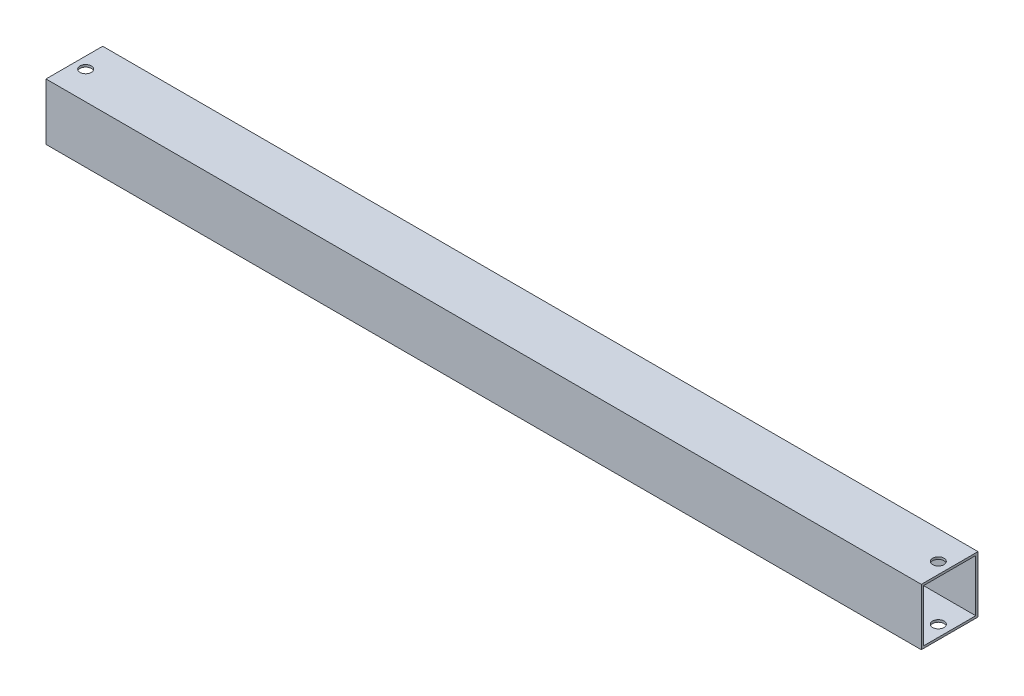
ISO-10303-21;
HEADER;
FILE_DESCRIPTION(('STEP AP214'),'2;1');
FILE_NAME('part.step','',(''),(''),'','','');
FILE_SCHEMA(('AUTOMOTIVE_DESIGN { 1 0 10303 214 1 1 1 1 }'));
ENDSEC;
DATA;
#1=APPLICATION_CONTEXT('core data for automotive mechanical design processes');
#2=APPLICATION_PROTOCOL_DEFINITION('international standard','automotive_design',2000,#1);
#3=PRODUCT_CONTEXT('',#1,'mechanical');
#4=PRODUCT('Part','Part','',(#3));
#5=PRODUCT_RELATED_PRODUCT_CATEGORY('part','',(#4));
#6=PRODUCT_DEFINITION_FORMATION('','',#4);
#7=PRODUCT_DEFINITION_CONTEXT('part definition',#1,'design');
#8=PRODUCT_DEFINITION('design','',#6,#7);
#9=PRODUCT_DEFINITION_SHAPE('','',#8);
#10=(LENGTH_UNIT() NAMED_UNIT(*) SI_UNIT(.MILLI.,.METRE.));
#11=(NAMED_UNIT(*) PLANE_ANGLE_UNIT() SI_UNIT($,.RADIAN.));
#12=(NAMED_UNIT(*) SI_UNIT($,.STERADIAN.) SOLID_ANGLE_UNIT());
#13=UNCERTAINTY_MEASURE_WITH_UNIT(LENGTH_MEASURE(1.E-05),#10,'distance_accuracy_value','');
#14=(GEOMETRIC_REPRESENTATION_CONTEXT(3) GLOBAL_UNCERTAINTY_ASSIGNED_CONTEXT((#13)) GLOBAL_UNIT_ASSIGNED_CONTEXT((#10,
#11,#12)) REPRESENTATION_CONTEXT('',''));
#15=CARTESIAN_POINT('',(0.,0.,0.));
#16=DIRECTION('',(0.,0.,1.));
#17=DIRECTION('',(1.,0.,0.));
#18=AXIS2_PLACEMENT_3D('',#15,#16,#17);
#19=CARTESIAN_POINT('',(386.,0.,0.));
#20=DIRECTION('',(-1.,0.,0.));
#21=DIRECTION('',(0.,0.,1.));
#22=AXIS2_PLACEMENT_3D('',#19,#20,#21);
#23=PLANE('',#22);
#24=DIRECTION('',(0.,1.,0.));
#25=VECTOR('',#24,1.);
#26=CARTESIAN_POINT('',(386.,-12.5,-12.5));
#27=LINE('',#26,#25);
#28=CARTESIAN_POINT('',(386.,-12.5,-12.5));
#29=VERTEX_POINT('',#28);
#30=CARTESIAN_POINT('',(386.,12.5,-12.5));
#31=VERTEX_POINT('',#30);
#32=EDGE_CURVE('E142',#29,#31,#27,.T.);
#33=ORIENTED_EDGE('',*,*,#32,.T.);
#34=DIRECTION('',(0.,0.,1.));
#35=VECTOR('',#34,1.);
#36=CARTESIAN_POINT('',(386.,12.5,12.5));
#37=LINE('',#36,#35);
#38=CARTESIAN_POINT('',(386.,12.5,12.5));
#39=VERTEX_POINT('',#38);
#40=EDGE_CURVE('E145',#31,#39,#37,.T.);
#41=ORIENTED_EDGE('',*,*,#40,.T.);
#42=DIRECTION('',(0.,-1.,0.));
#43=VECTOR('',#42,1.);
#44=CARTESIAN_POINT('',(386.,-12.5,12.5));
#45=LINE('',#44,#43);
#46=CARTESIAN_POINT('',(386.,-12.5,12.5));
#47=VERTEX_POINT('',#46);
#48=EDGE_CURVE('E148',#39,#47,#45,.T.);
#49=ORIENTED_EDGE('',*,*,#48,.T.);
#50=DIRECTION('',(0.,0.,-1.));
#51=VECTOR('',#50,1.);
#52=CARTESIAN_POINT('',(386.,-12.5,12.5));
#53=LINE('',#52,#51);
#54=EDGE_CURVE('E150',#47,#29,#53,.T.);
#55=ORIENTED_EDGE('',*,*,#54,.T.);
#56=EDGE_LOOP('',(#33,#41,#49,#55));
#57=FACE_BOUND('',#56,.T.);
#58=DIRECTION('',(0.,-1.,0.));
#59=VECTOR('',#58,1.);
#60=CARTESIAN_POINT('',(386.,-11.5,11.5));
#61=LINE('',#60,#59);
#62=CARTESIAN_POINT('',(386.,11.5,11.5));
#63=VERTEX_POINT('',#62);
#64=CARTESIAN_POINT('',(386.,-11.5,11.5));
#65=VERTEX_POINT('',#64);
#66=EDGE_CURVE('E104',#63,#65,#61,.T.);
#67=ORIENTED_EDGE('',*,*,#66,.F.);
#68=DIRECTION('',(0.,0.,1.));
#69=VECTOR('',#68,1.);
#70=CARTESIAN_POINT('',(386.,11.5,11.5));
#71=LINE('',#70,#69);
#72=CARTESIAN_POINT('',(386.,11.5,-11.5));
#73=VERTEX_POINT('',#72);
#74=EDGE_CURVE('E126',#73,#63,#71,.T.);
#75=ORIENTED_EDGE('',*,*,#74,.F.);
#76=DIRECTION('',(0.,1.,0.));
#77=VECTOR('',#76,1.);
#78=CARTESIAN_POINT('',(386.,-11.5,-11.5));
#79=LINE('',#78,#77);
#80=CARTESIAN_POINT('',(386.,-11.5,-11.5));
#81=VERTEX_POINT('',#80);
#82=EDGE_CURVE('E124',#81,#73,#79,.T.);
#83=ORIENTED_EDGE('',*,*,#82,.F.);
#84=DIRECTION('',(0.,0.,-1.));
#85=VECTOR('',#84,1.);
#86=CARTESIAN_POINT('',(386.,-11.5,11.5));
#87=LINE('',#86,#85);
#88=EDGE_CURVE('E112',#65,#81,#87,.T.);
#89=ORIENTED_EDGE('',*,*,#88,.F.);
#90=EDGE_LOOP('',(#67,#75,#83,#89));
#91=FACE_BOUND('',#90,.T.);
#92=ADVANCED_FACE('F37',(#57,#91),#23,.F.);
#93=CARTESIAN_POINT('',(0.,0.,0.));
#94=DIRECTION('',(-1.,0.,0.));
#95=DIRECTION('',(0.,0.,1.));
#96=AXIS2_PLACEMENT_3D('',#93,#94,#95);
#97=PLANE('',#96);
#98=DIRECTION('',(0.,1.,0.));
#99=VECTOR('',#98,1.);
#100=CARTESIAN_POINT('',(0.,-12.5,-12.5));
#101=LINE('',#100,#99);
#102=CARTESIAN_POINT('',(0.,-12.5,-12.5));
#103=VERTEX_POINT('',#102);
#104=CARTESIAN_POINT('',(0.,12.5,-12.5));
#105=VERTEX_POINT('',#104);
#106=EDGE_CURVE('E120',#103,#105,#101,.T.);
#107=ORIENTED_EDGE('',*,*,#106,.F.);
#108=DIRECTION('',(0.,0.,-1.));
#109=VECTOR('',#108,1.);
#110=CARTESIAN_POINT('',(0.,-12.5,12.5));
#111=LINE('',#110,#109);
#112=CARTESIAN_POINT('',(0.,-12.5,12.5));
#113=VERTEX_POINT('',#112);
#114=EDGE_CURVE('E146',#113,#103,#111,.T.);
#115=ORIENTED_EDGE('',*,*,#114,.F.);
#116=DIRECTION('',(0.,-1.,0.));
#117=VECTOR('',#116,1.);
#118=CARTESIAN_POINT('',(0.,-12.5,12.5));
#119=LINE('',#118,#117);
#120=CARTESIAN_POINT('',(0.,12.5,12.5));
#121=VERTEX_POINT('',#120);
#122=EDGE_CURVE('E157',#121,#113,#119,.T.);
#123=ORIENTED_EDGE('',*,*,#122,.F.);
#124=DIRECTION('',(0.,0.,1.));
#125=VECTOR('',#124,1.);
#126=CARTESIAN_POINT('',(0.,12.5,12.5));
#127=LINE('',#126,#125);
#128=EDGE_CURVE('E155',#105,#121,#127,.T.);
#129=ORIENTED_EDGE('',*,*,#128,.F.);
#130=EDGE_LOOP('',(#107,#115,#123,#129));
#131=FACE_BOUND('',#130,.T.);
#132=DIRECTION('',(0.,0.,1.));
#133=VECTOR('',#132,1.);
#134=CARTESIAN_POINT('',(0.,11.5,11.5));
#135=LINE('',#134,#133);
#136=CARTESIAN_POINT('',(0.,11.5,-11.5));
#137=VERTEX_POINT('',#136);
#138=CARTESIAN_POINT('',(0.,11.5,11.5));
#139=VERTEX_POINT('',#138);
#140=EDGE_CURVE('E113',#137,#139,#135,.T.);
#141=ORIENTED_EDGE('',*,*,#140,.T.);
#142=DIRECTION('',(0.,-1.,0.));
#143=VECTOR('',#142,1.);
#144=CARTESIAN_POINT('',(0.,-11.5,11.5));
#145=LINE('',#144,#143);
#146=CARTESIAN_POINT('',(0.,-11.5,11.5));
#147=VERTEX_POINT('',#146);
#148=EDGE_CURVE('E62',#139,#147,#145,.T.);
#149=ORIENTED_EDGE('',*,*,#148,.T.);
#150=DIRECTION('',(0.,0.,-1.));
#151=VECTOR('',#150,1.);
#152=CARTESIAN_POINT('',(0.,-11.5,11.5));
#153=LINE('',#152,#151);
#154=CARTESIAN_POINT('',(0.,-11.5,-11.5));
#155=VERTEX_POINT('',#154);
#156=EDGE_CURVE('E119',#147,#155,#153,.T.);
#157=ORIENTED_EDGE('',*,*,#156,.T.);
#158=DIRECTION('',(0.,1.,0.));
#159=VECTOR('',#158,1.);
#160=CARTESIAN_POINT('',(0.,-11.5,-11.5));
#161=LINE('',#160,#159);
#162=EDGE_CURVE('E134',#155,#137,#161,.T.);
#163=ORIENTED_EDGE('',*,*,#162,.T.);
#164=EDGE_LOOP('',(#141,#149,#157,#163));
#165=FACE_BOUND('',#164,.T.);
#166=ADVANCED_FACE('F204',(#131,#165),#97,.T.);
#167=CARTESIAN_POINT('',(386.,-12.5,-12.5));
#168=DIRECTION('',(0.,0.,1.));
#169=DIRECTION('',(1.,0.,0.));
#170=AXIS2_PLACEMENT_3D('',#167,#168,#169);
#171=PLANE('',#170);
#172=ORIENTED_EDGE('',*,*,#106,.T.);
#173=DIRECTION('',(-1.,0.,0.));
#174=VECTOR('',#173,1.);
#175=CARTESIAN_POINT('',(386.,12.5,-12.5));
#176=LINE('',#175,#174);
#177=EDGE_CURVE('E11',#31,#105,#176,.T.);
#178=ORIENTED_EDGE('',*,*,#177,.F.);
#179=ORIENTED_EDGE('',*,*,#32,.F.);
#180=DIRECTION('',(-1.,0.,0.));
#181=VECTOR('',#180,1.);
#182=CARTESIAN_POINT('',(386.,-12.5,-12.5));
#183=LINE('',#182,#181);
#184=EDGE_CURVE('E152',#29,#103,#183,.T.);
#185=ORIENTED_EDGE('',*,*,#184,.T.);
#186=EDGE_LOOP('',(#172,#178,#179,#185));
#187=FACE_BOUND('',#186,.T.);
#188=ADVANCED_FACE('F39',(#187),#171,.F.);
#189=CARTESIAN_POINT('',(386.,12.5,12.5));
#190=DIRECTION('',(0.,-1.,0.));
#191=DIRECTION('',(0.,0.,-1.));
#192=AXIS2_PLACEMENT_3D('',#189,#190,#191);
#193=PLANE('',#192);
#194=CARTESIAN_POINT('',(5.,12.5,0.));
#195=DIRECTION('',(0.,1.,0.));
#196=DIRECTION('',(0.,0.,1.));
#197=AXIS2_PLACEMENT_3D('',#194,#195,#196);
#198=CIRCLE('',#197,2.5);
#199=CARTESIAN_POINT('',(5.,12.5,2.5));
#200=VERTEX_POINT('',#199);
#201=EDGE_CURVE('E175',#200,#200,#198,.T.);
#202=ORIENTED_EDGE('',*,*,#201,.F.);
#203=EDGE_LOOP('',(#202));
#204=FACE_BOUND('',#203,.T.);
#205=CARTESIAN_POINT('',(381.,12.5,0.));
#206=DIRECTION('',(0.,1.,0.));
#207=DIRECTION('',(0.,0.,1.));
#208=AXIS2_PLACEMENT_3D('',#205,#206,#207);
#209=CIRCLE('',#208,2.50000000000002);
#210=CARTESIAN_POINT('',(381.,12.5,2.50000000000002));
#211=VERTEX_POINT('',#210);
#212=EDGE_CURVE('E180',#211,#211,#209,.T.);
#213=ORIENTED_EDGE('',*,*,#212,.F.);
#214=EDGE_LOOP('',(#213));
#215=FACE_BOUND('',#214,.T.);
#216=ORIENTED_EDGE('',*,*,#128,.T.);
#217=DIRECTION('',(-1.,0.,0.));
#218=VECTOR('',#217,1.);
#219=CARTESIAN_POINT('',(386.,12.5,12.5));
#220=LINE('',#219,#218);
#221=EDGE_CURVE('E46',#39,#121,#220,.T.);
#222=ORIENTED_EDGE('',*,*,#221,.F.);
#223=ORIENTED_EDGE('',*,*,#40,.F.);
#224=ORIENTED_EDGE('',*,*,#177,.T.);
#225=EDGE_LOOP('',(#216,#222,#223,#224));
#226=FACE_BOUND('',#225,.T.);
#227=ADVANCED_FACE('F228',(#204,#215,#226),#193,.F.);
#228=CARTESIAN_POINT('',(386.,-12.5,12.5));
#229=DIRECTION('',(0.,0.,-1.));
#230=DIRECTION('',(-1.,0.,0.));
#231=AXIS2_PLACEMENT_3D('',#228,#229,#230);
#232=PLANE('',#231);
#233=ORIENTED_EDGE('',*,*,#122,.T.);
#234=DIRECTION('',(-1.,0.,0.));
#235=VECTOR('',#234,1.);
#236=CARTESIAN_POINT('',(386.,-12.5,12.5));
#237=LINE('',#236,#235);
#238=EDGE_CURVE('E162',#47,#113,#237,.T.);
#239=ORIENTED_EDGE('',*,*,#238,.F.);
#240=ORIENTED_EDGE('',*,*,#48,.F.);
#241=ORIENTED_EDGE('',*,*,#221,.T.);
#242=EDGE_LOOP('',(#233,#239,#240,#241));
#243=FACE_BOUND('',#242,.T.);
#244=ADVANCED_FACE('F226',(#243),#232,.F.);
#245=CARTESIAN_POINT('',(386.,-12.5,12.5));
#246=DIRECTION('',(0.,1.,0.));
#247=DIRECTION('',(0.,0.,1.));
#248=AXIS2_PLACEMENT_3D('',#245,#246,#247);
#249=PLANE('',#248);
#250=CARTESIAN_POINT('',(5.,-12.5,0.));
#251=DIRECTION('',(0.,1.,0.));
#252=DIRECTION('',(0.,0.,1.));
#253=AXIS2_PLACEMENT_3D('',#250,#251,#252);
#254=CIRCLE('',#253,2.5);
#255=CARTESIAN_POINT('',(5.,-12.5,2.5));
#256=VERTEX_POINT('',#255);
#257=EDGE_CURVE('E169',#256,#256,#254,.T.);
#258=ORIENTED_EDGE('',*,*,#257,.T.);
#259=EDGE_LOOP('',(#258));
#260=FACE_BOUND('',#259,.T.);
#261=CARTESIAN_POINT('',(381.,-12.5,0.));
#262=DIRECTION('',(0.,1.,0.));
#263=DIRECTION('',(0.,0.,1.));
#264=AXIS2_PLACEMENT_3D('',#261,#262,#263);
#265=CIRCLE('',#264,2.50000000000002);
#266=CARTESIAN_POINT('',(381.,-12.5,2.50000000000002));
#267=VERTEX_POINT('',#266);
#268=EDGE_CURVE('E185',#267,#267,#265,.T.);
#269=ORIENTED_EDGE('',*,*,#268,.T.);
#270=EDGE_LOOP('',(#269));
#271=FACE_BOUND('',#270,.T.);
#272=ORIENTED_EDGE('',*,*,#114,.T.);
#273=ORIENTED_EDGE('',*,*,#184,.F.);
#274=ORIENTED_EDGE('',*,*,#54,.F.);
#275=ORIENTED_EDGE('',*,*,#238,.T.);
#276=EDGE_LOOP('',(#272,#273,#274,#275));
#277=FACE_BOUND('',#276,.T.);
#278=ADVANCED_FACE('F223',(#260,#271,#277),#249,.F.);
#279=CARTESIAN_POINT('',(386.,-11.5,11.5));
#280=DIRECTION('',(0.,0.,-1.));
#281=DIRECTION('',(-1.,0.,0.));
#282=AXIS2_PLACEMENT_3D('',#279,#280,#281);
#283=PLANE('',#282);
#284=ORIENTED_EDGE('',*,*,#148,.F.);
#285=DIRECTION('',(-1.,0.,0.));
#286=VECTOR('',#285,1.);
#287=CARTESIAN_POINT('',(386.,11.5,11.5));
#288=LINE('',#287,#286);
#289=EDGE_CURVE('E108',#63,#139,#288,.T.);
#290=ORIENTED_EDGE('',*,*,#289,.F.);
#291=ORIENTED_EDGE('',*,*,#66,.T.);
#292=DIRECTION('',(-1.,0.,0.));
#293=VECTOR('',#292,1.);
#294=CARTESIAN_POINT('',(386.,-11.5,11.5));
#295=LINE('',#294,#293);
#296=EDGE_CURVE('E107',#65,#147,#295,.T.);
#297=ORIENTED_EDGE('',*,*,#296,.T.);
#298=EDGE_LOOP('',(#284,#290,#291,#297));
#299=FACE_BOUND('',#298,.T.);
#300=ADVANCED_FACE('F106',(#299),#283,.T.);
#301=CARTESIAN_POINT('',(386.,-11.5,11.5));
#302=DIRECTION('',(0.,1.,0.));
#303=DIRECTION('',(0.,0.,1.));
#304=AXIS2_PLACEMENT_3D('',#301,#302,#303);
#305=PLANE('',#304);
#306=CARTESIAN_POINT('',(5.,-11.5,0.));
#307=DIRECTION('',(0.,1.,0.));
#308=DIRECTION('',(0.,0.,1.));
#309=AXIS2_PLACEMENT_3D('',#306,#307,#308);
#310=CIRCLE('',#309,2.5);
#311=CARTESIAN_POINT('',(5.,-11.5,2.5));
#312=VERTEX_POINT('',#311);
#313=EDGE_CURVE('E132',#312,#312,#310,.T.);
#314=ORIENTED_EDGE('',*,*,#313,.F.);
#315=EDGE_LOOP('',(#314));
#316=FACE_BOUND('',#315,.T.);
#317=CARTESIAN_POINT('',(381.,-11.5,0.));
#318=DIRECTION('',(0.,1.,0.));
#319=DIRECTION('',(0.,0.,1.));
#320=AXIS2_PLACEMENT_3D('',#317,#318,#319);
#321=CIRCLE('',#320,2.50000000000002);
#322=CARTESIAN_POINT('',(381.,-11.5,2.50000000000002));
#323=VERTEX_POINT('',#322);
#324=EDGE_CURVE('E168',#323,#323,#321,.T.);
#325=ORIENTED_EDGE('',*,*,#324,.F.);
#326=EDGE_LOOP('',(#325));
#327=FACE_BOUND('',#326,.T.);
#328=ORIENTED_EDGE('',*,*,#156,.F.);
#329=ORIENTED_EDGE('',*,*,#296,.F.);
#330=ORIENTED_EDGE('',*,*,#88,.T.);
#331=DIRECTION('',(-1.,0.,0.));
#332=VECTOR('',#331,1.);
#333=CARTESIAN_POINT('',(386.,-11.5,-11.5));
#334=LINE('',#333,#332);
#335=EDGE_CURVE('E121',#81,#155,#334,.T.);
#336=ORIENTED_EDGE('',*,*,#335,.T.);
#337=EDGE_LOOP('',(#328,#329,#330,#336));
#338=FACE_BOUND('',#337,.T.);
#339=ADVANCED_FACE('F116',(#316,#327,#338),#305,.T.);
#340=CARTESIAN_POINT('',(386.,-11.5,-11.5));
#341=DIRECTION('',(0.,0.,1.));
#342=DIRECTION('',(1.,0.,0.));
#343=AXIS2_PLACEMENT_3D('',#340,#341,#342);
#344=PLANE('',#343);
#345=ORIENTED_EDGE('',*,*,#162,.F.);
#346=ORIENTED_EDGE('',*,*,#335,.F.);
#347=ORIENTED_EDGE('',*,*,#82,.T.);
#348=DIRECTION('',(-1.,0.,0.));
#349=VECTOR('',#348,1.);
#350=CARTESIAN_POINT('',(386.,11.5,-11.5));
#351=LINE('',#350,#349);
#352=EDGE_CURVE('E54',#73,#137,#351,.T.);
#353=ORIENTED_EDGE('',*,*,#352,.T.);
#354=EDGE_LOOP('',(#345,#346,#347,#353));
#355=FACE_BOUND('',#354,.T.);
#356=ADVANCED_FACE('F200',(#355),#344,.T.);
#357=CARTESIAN_POINT('',(386.,11.5,11.5));
#358=DIRECTION('',(0.,-1.,0.));
#359=DIRECTION('',(0.,0.,-1.));
#360=AXIS2_PLACEMENT_3D('',#357,#358,#359);
#361=PLANE('',#360);
#362=CARTESIAN_POINT('',(5.,11.5,0.));
#363=DIRECTION('',(0.,-1.,0.));
#364=DIRECTION('',(0.,0.,-1.));
#365=AXIS2_PLACEMENT_3D('',#362,#363,#364);
#366=CIRCLE('',#365,2.5);
#367=CARTESIAN_POINT('',(5.,11.5,-2.5));
#368=VERTEX_POINT('',#367);
#369=EDGE_CURVE('E41',#368,#368,#366,.T.);
#370=ORIENTED_EDGE('',*,*,#369,.F.);
#371=EDGE_LOOP('',(#370));
#372=FACE_BOUND('',#371,.T.);
#373=CARTESIAN_POINT('',(381.,11.5,0.));
#374=DIRECTION('',(0.,-1.,0.));
#375=DIRECTION('',(0.,0.,-1.));
#376=AXIS2_PLACEMENT_3D('',#373,#374,#375);
#377=CIRCLE('',#376,2.50000000000002);
#378=CARTESIAN_POINT('',(381.,11.5,-2.50000000000002));
#379=VERTEX_POINT('',#378);
#380=EDGE_CURVE('E166',#379,#379,#377,.T.);
#381=ORIENTED_EDGE('',*,*,#380,.F.);
#382=EDGE_LOOP('',(#381));
#383=FACE_BOUND('',#382,.T.);
#384=ORIENTED_EDGE('',*,*,#140,.F.);
#385=ORIENTED_EDGE('',*,*,#352,.F.);
#386=ORIENTED_EDGE('',*,*,#74,.T.);
#387=ORIENTED_EDGE('',*,*,#289,.T.);
#388=EDGE_LOOP('',(#384,#385,#386,#387));
#389=FACE_BOUND('',#388,.T.);
#390=ADVANCED_FACE('F196',(#372,#383,#389),#361,.T.);
#391=CARTESIAN_POINT('',(381.,-12.5,0.));
#392=DIRECTION('',(0.,1.,0.));
#393=DIRECTION('',(0.,0.,1.));
#394=AXIS2_PLACEMENT_3D('',#391,#392,#393);
#395=CYLINDRICAL_SURFACE('',#394,2.50000000000002);
#396=ORIENTED_EDGE('',*,*,#380,.T.);
#397=EDGE_LOOP('',(#396));
#398=FACE_BOUND('',#397,.T.);
#399=ORIENTED_EDGE('',*,*,#212,.T.);
#400=EDGE_LOOP('',(#399));
#401=FACE_BOUND('',#400,.T.);
#402=ADVANCED_FACE('F199',(#398,#401),#395,.F.);
#403=CARTESIAN_POINT('',(5.,-12.5,0.));
#404=DIRECTION('',(0.,1.,0.));
#405=DIRECTION('',(0.,0.,1.));
#406=AXIS2_PLACEMENT_3D('',#403,#404,#405);
#407=CYLINDRICAL_SURFACE('',#406,2.5);
#408=ORIENTED_EDGE('',*,*,#369,.T.);
#409=EDGE_LOOP('',(#408));
#410=FACE_BOUND('',#409,.T.);
#411=ORIENTED_EDGE('',*,*,#201,.T.);
#412=EDGE_LOOP('',(#411));
#413=FACE_BOUND('',#412,.T.);
#414=ADVANCED_FACE('F193',(#410,#413),#407,.F.);
#415=ORIENTED_EDGE('',*,*,#324,.T.);
#416=EDGE_LOOP('',(#415));
#417=FACE_BOUND('',#416,.T.);
#418=ORIENTED_EDGE('',*,*,#268,.F.);
#419=EDGE_LOOP('',(#418));
#420=FACE_BOUND('',#419,.T.);
#421=ADVANCED_FACE('F254',(#417,#420),#395,.F.);
#422=ORIENTED_EDGE('',*,*,#313,.T.);
#423=EDGE_LOOP('',(#422));
#424=FACE_BOUND('',#423,.T.);
#425=ORIENTED_EDGE('',*,*,#257,.F.);
#426=EDGE_LOOP('',(#425));
#427=FACE_BOUND('',#426,.T.);
#428=ADVANCED_FACE('F259',(#424,#427),#407,.F.);
#429=CLOSED_SHELL('',(#92,#166,#188,#227,#244,#278,#300,#339,#356,#390,#402,#414,#421,#428));
#430=MANIFOLD_SOLID_BREP('B2',#429);
#431=ADVANCED_BREP_SHAPE_REPRESENTATION('',(#18,#430),#14);
#432=SHAPE_DEFINITION_REPRESENTATION(#9,#431);
ENDSEC;
END-ISO-10303-21;
